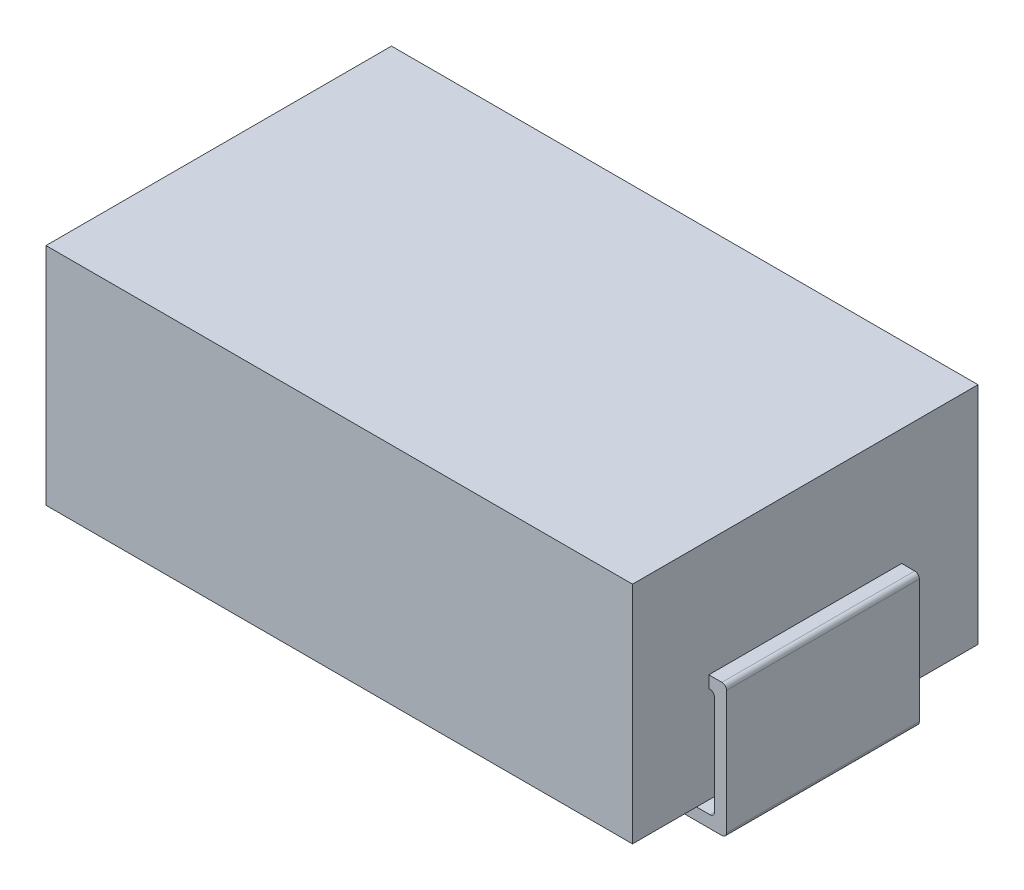
ISO-10303-21;
HEADER;
FILE_DESCRIPTION(('STEP AP214'),'2;1');
FILE_NAME('part.step','',(''),(''),'','','');
FILE_SCHEMA(('AUTOMOTIVE_DESIGN { 1 0 10303 214 1 1 1 1 }'));
ENDSEC;
DATA;
#1=APPLICATION_CONTEXT('core data for automotive mechanical design processes');
#2=APPLICATION_PROTOCOL_DEFINITION('international standard','automotive_design',2000,#1);
#3=PRODUCT_CONTEXT('',#1,'mechanical');
#4=PRODUCT('Part','Part','',(#3));
#5=PRODUCT_RELATED_PRODUCT_CATEGORY('part','',(#4));
#6=PRODUCT_DEFINITION_FORMATION('','',#4);
#7=PRODUCT_DEFINITION_CONTEXT('part definition',#1,'design');
#8=PRODUCT_DEFINITION('design','',#6,#7);
#9=PRODUCT_DEFINITION_SHAPE('','',#8);
#10=(LENGTH_UNIT() NAMED_UNIT(*) SI_UNIT(.MILLI.,.METRE.));
#11=(NAMED_UNIT(*) PLANE_ANGLE_UNIT() SI_UNIT($,.RADIAN.));
#12=(NAMED_UNIT(*) SI_UNIT($,.STERADIAN.) SOLID_ANGLE_UNIT());
#13=UNCERTAINTY_MEASURE_WITH_UNIT(LENGTH_MEASURE(1.E-05),#10,'distance_accuracy_value','');
#14=(GEOMETRIC_REPRESENTATION_CONTEXT(3) GLOBAL_UNCERTAINTY_ASSIGNED_CONTEXT((#13)) GLOBAL_UNIT_ASSIGNED_CONTEXT((#10,
#11,#12)) REPRESENTATION_CONTEXT('',''));
#15=CARTESIAN_POINT('',(0.,0.,0.));
#16=DIRECTION('',(0.,0.,1.));
#17=DIRECTION('',(1.,0.,0.));
#18=AXIS2_PLACEMENT_3D('',#15,#16,#17);
#19=CARTESIAN_POINT('',(-1.327542889156,-0.210787173708,1.2));
#20=DIRECTION('',(-1.,0.,0.));
#21=DIRECTION('',(0.,0.,1.));
#22=AXIS2_PLACEMENT_3D('',#19,#20,#21);
#23=PLANE('',#22);
#24=DIRECTION('',(0.,0.,-1.));
#25=VECTOR('',#24,1.);
#26=CARTESIAN_POINT('',(-1.32754288915623,-0.210787173708,1.2));
#27=LINE('',#26,#25);
#28=CARTESIAN_POINT('',(-1.32754288915612,-0.210787173708,1.2));
#29=VERTEX_POINT('',#28);
#30=CARTESIAN_POINT('',(-1.32754288915612,-0.210787173708,-1.2));
#31=VERTEX_POINT('',#30);
#32=EDGE_CURVE('E234',#29,#31,#27,.T.);
#33=ORIENTED_EDGE('',*,*,#32,.F.);
#34=DIRECTION('',(0.,1.,0.));
#35=VECTOR('',#34,1.);
#36=CARTESIAN_POINT('',(-1.327542889156,1.290695496503,1.2));
#37=LINE('',#36,#35);
#38=CARTESIAN_POINT('',(-1.32754288915612,-0.245870504814,1.2));
#39=VERTEX_POINT('',#38);
#40=EDGE_CURVE('E249',#39,#29,#37,.T.);
#41=ORIENTED_EDGE('',*,*,#40,.F.);
#42=DIRECTION('',(0.,0.,-1.));
#43=VECTOR('',#42,1.);
#44=CARTESIAN_POINT('',(-1.32754288915623,-0.245870504814,1.2));
#45=LINE('',#44,#43);
#46=CARTESIAN_POINT('',(-1.32754288915612,-0.245870504814,-1.2));
#47=VERTEX_POINT('',#46);
#48=EDGE_CURVE('E362',#47,#39,#45,.F.);
#49=ORIENTED_EDGE('',*,*,#48,.F.);
#50=DIRECTION('',(0.,1.,0.));
#51=VECTOR('',#50,1.);
#52=CARTESIAN_POINT('',(-1.327542889156,-0.210787173708,-1.2));
#53=LINE('',#52,#51);
#54=EDGE_CURVE('E325',#31,#47,#53,.F.);
#55=ORIENTED_EDGE('',*,*,#54,.F.);
#56=EDGE_LOOP('',(#33,#41,#49,#55));
#57=FACE_BOUND('',#56,.T.);
#58=ADVANCED_FACE('F17',(#57),#23,.F.);
#59=CARTESIAN_POINT('',(1.327542889156,-0.210787173708,1.2));
#60=DIRECTION('',(-1.,0.,0.));
#61=DIRECTION('',(0.,0.,1.));
#62=AXIS2_PLACEMENT_3D('',#59,#60,#61);
#63=PLANE('',#62);
#64=DIRECTION('',(0.,1.,0.));
#65=VECTOR('',#64,1.);
#66=CARTESIAN_POINT('',(1.327542889156,-0.210787173708,1.2));
#67=LINE('',#66,#65);
#68=CARTESIAN_POINT('',(1.32754288915612,-0.245870504814,1.2));
#69=VERTEX_POINT('',#68);
#70=CARTESIAN_POINT('',(1.32754288915612,-0.210787173708,1.2));
#71=VERTEX_POINT('',#70);
#72=EDGE_CURVE('E323',#69,#71,#67,.T.);
#73=ORIENTED_EDGE('',*,*,#72,.T.);
#74=DIRECTION('',(0.,0.,-1.));
#75=VECTOR('',#74,1.);
#76=CARTESIAN_POINT('',(1.32754288915623,-0.210787173708,1.2));
#77=LINE('',#76,#75);
#78=CARTESIAN_POINT('',(1.32754288915612,-0.210787173708,-1.2));
#79=VERTEX_POINT('',#78);
#80=EDGE_CURVE('E281',#79,#71,#77,.F.);
#81=ORIENTED_EDGE('',*,*,#80,.F.);
#82=DIRECTION('',(0.,1.,0.));
#83=VECTOR('',#82,1.);
#84=CARTESIAN_POINT('',(1.327542889156,1.290695496503,-1.2));
#85=LINE('',#84,#83);
#86=CARTESIAN_POINT('',(1.32754288915612,-0.245870504814,-1.2));
#87=VERTEX_POINT('',#86);
#88=EDGE_CURVE('E396',#79,#87,#85,.F.);
#89=ORIENTED_EDGE('',*,*,#88,.T.);
#90=DIRECTION('',(0.,0.,-1.));
#91=VECTOR('',#90,1.);
#92=CARTESIAN_POINT('',(1.32754288915623,-0.245870504814,1.2));
#93=LINE('',#92,#91);
#94=EDGE_CURVE('E278',#69,#87,#93,.T.);
#95=ORIENTED_EDGE('',*,*,#94,.F.);
#96=EDGE_LOOP('',(#73,#81,#89,#95));
#97=FACE_BOUND('',#96,.T.);
#98=ADVANCED_FACE('F587',(#97),#63,.T.);
#99=CARTESIAN_POINT('',(-1.385001223603,-0.210787173708,1.2));
#100=DIRECTION('',(0.,0.,-1.));
#101=DIRECTION('',(-1.,0.,0.));
#102=AXIS2_PLACEMENT_3D('',#99,#100,#101);
#103=CYLINDRICAL_SURFACE('',#102,0.05745833444677);
#104=CARTESIAN_POINT('',(-1.385001223603,-0.210787173708,1.2));
#105=DIRECTION('',(0.,0.,-1.));
#106=DIRECTION('',(-1.,0.,0.));
#107=AXIS2_PLACEMENT_3D('',#104,#105,#106);
#108=CIRCLE('',#107,0.05745833444677);
#109=CARTESIAN_POINT('',(-1.385001223603,-0.153328839261,1.2));
#110=VERTEX_POINT('',#109);
#111=EDGE_CURVE('E250',#29,#110,#108,.F.);
#112=ORIENTED_EDGE('',*,*,#111,.F.);
#113=ORIENTED_EDGE('',*,*,#32,.T.);
#114=CARTESIAN_POINT('',(-1.385001223603,-0.210787173708,-1.2));
#115=DIRECTION('',(0.,0.,-1.));
#116=DIRECTION('',(-1.,0.,0.));
#117=AXIS2_PLACEMENT_3D('',#114,#115,#116);
#118=CIRCLE('',#117,0.05745833444677);
#119=CARTESIAN_POINT('',(-1.385001223603,-0.153328839261,-1.2));
#120=VERTEX_POINT('',#119);
#121=EDGE_CURVE('E413',#31,#120,#118,.F.);
#122=ORIENTED_EDGE('',*,*,#121,.T.);
#123=DIRECTION('',(0.,0.,-1.));
#124=VECTOR('',#123,1.);
#125=CARTESIAN_POINT('',(-1.385001223603,-0.153328839261,1.2));
#126=LINE('',#125,#124);
#127=EDGE_CURVE('E269',#120,#110,#126,.F.);
#128=ORIENTED_EDGE('',*,*,#127,.T.);
#129=EDGE_LOOP('',(#112,#113,#122,#128));
#130=FACE_BOUND('',#129,.T.);
#131=ADVANCED_FACE('F870',(#130),#103,.T.);
#132=CARTESIAN_POINT('',(-3.812785749813,1.290695496503,1.2));
#133=DIRECTION('',(0.,0.,1.));
#134=DIRECTION('',(1.,0.,0.));
#135=AXIS2_PLACEMENT_3D('',#132,#133,#134);
#136=PLANE('',#135);
#137=DIRECTION('',(1.,0.,0.));
#138=VECTOR('',#137,1.);
#139=CARTESIAN_POINT('',(-3.812785749813,1.348153830949,1.2));
#140=LINE('',#139,#138);
#141=CARTESIAN_POINT('',(-3.65,1.348153830949,1.2));
#142=VERTEX_POINT('',#141);
#143=CARTESIAN_POINT('',(-3.812785749813,1.348153830949,1.2));
#144=VERTEX_POINT('',#143);
#145=EDGE_CURVE('E368',#142,#144,#140,.F.);
#146=ORIENTED_EDGE('',*,*,#145,.T.);
#147=CARTESIAN_POINT('',(-3.812785749813,1.290695496503,1.2));
#148=DIRECTION('',(0.,0.,-1.));
#149=DIRECTION('',(-1.,0.,0.));
#150=AXIS2_PLACEMENT_3D('',#147,#148,#149);
#151=CIRCLE('',#150,0.05745833444677);
#152=CARTESIAN_POINT('',(-3.87024408425939,1.290695496503,1.2));
#153=VERTEX_POINT('',#152);
#154=EDGE_CURVE('E230',#144,#153,#151,.F.);
#155=ORIENTED_EDGE('',*,*,#154,.T.);
#156=DIRECTION('',(0.,1.,0.));
#157=VECTOR('',#156,1.);
#158=CARTESIAN_POINT('',(-3.870244084259,1.290695496503,1.2));
#159=LINE('',#158,#157);
#160=CARTESIAN_POINT('',(-3.870244084259,-0.245870504814,1.2));
#161=VERTEX_POINT('',#160);
#162=EDGE_CURVE('E223',#153,#161,#159,.F.);
#163=ORIENTED_EDGE('',*,*,#162,.T.);
#164=CARTESIAN_POINT('',(-3.812785749813,-0.245870504814,1.2));
#165=DIRECTION('',(0.,0.,-1.));
#166=DIRECTION('',(-1.,0.,0.));
#167=AXIS2_PLACEMENT_3D('',#164,#165,#166);
#168=CIRCLE('',#167,0.05745833444677);
#169=CARTESIAN_POINT('',(-3.812785749813,-0.303328839260885,1.2));
#170=VERTEX_POINT('',#169);
#171=EDGE_CURVE('E20',#161,#170,#168,.F.);
#172=ORIENTED_EDGE('',*,*,#171,.T.);
#173=DIRECTION('',(1.,0.,0.));
#174=VECTOR('',#173,1.);
#175=CARTESIAN_POINT('',(-3.812785749813,-0.303328839261,1.2));
#176=LINE('',#175,#174);
#177=CARTESIAN_POINT('',(-1.385001223603,-0.303328839261,1.2));
#178=VERTEX_POINT('',#177);
#179=EDGE_CURVE('E267',#170,#178,#176,.T.);
#180=ORIENTED_EDGE('',*,*,#179,.T.);
#181=CARTESIAN_POINT('',(-1.385001223603,-0.245870504814,1.2));
#182=DIRECTION('',(0.,0.,-1.));
#183=DIRECTION('',(-1.,0.,0.));
#184=AXIS2_PLACEMENT_3D('',#181,#182,#183);
#185=CIRCLE('',#184,0.05745833444677);
#186=EDGE_CURVE('E364',#39,#178,#185,.T.);
#187=ORIENTED_EDGE('',*,*,#186,.F.);
#188=ORIENTED_EDGE('',*,*,#40,.T.);
#189=ORIENTED_EDGE('',*,*,#111,.T.);
#190=DIRECTION('',(1.,0.,0.));
#191=VECTOR('',#190,1.);
#192=CARTESIAN_POINT('',(-3.662785749813,-0.153328839261,1.2));
#193=LINE('',#192,#191);
#194=CARTESIAN_POINT('',(-3.662785749813,-0.153328839261065,1.2));
#195=VERTEX_POINT('',#194);
#196=EDGE_CURVE('E268',#110,#195,#193,.F.);
#197=ORIENTED_EDGE('',*,*,#196,.T.);
#198=CARTESIAN_POINT('',(-3.662785749813,-0.09587050481436,1.2));
#199=DIRECTION('',(0.,0.,-1.));
#200=DIRECTION('',(-1.,0.,0.));
#201=AXIS2_PLACEMENT_3D('',#198,#199,#200);
#202=CIRCLE('',#201,0.05745833444677);
#203=CARTESIAN_POINT('',(-3.720244084259,-0.09587050481436,1.2));
#204=VERTEX_POINT('',#203);
#205=EDGE_CURVE('E255',#195,#204,#202,.T.);
#206=ORIENTED_EDGE('',*,*,#205,.T.);
#207=DIRECTION('',(0.,1.,0.));
#208=VECTOR('',#207,1.);
#209=CARTESIAN_POINT('',(-3.720244084259,1.290695496503,1.2));
#210=LINE('',#209,#208);
#211=CARTESIAN_POINT('',(-3.72024408425939,1.142356626712,1.2));
#212=VERTEX_POINT('',#211);
#213=EDGE_CURVE('E257',#204,#212,#210,.T.);
#214=ORIENTED_EDGE('',*,*,#213,.T.);
#215=CARTESIAN_POINT('',(-3.662785749813,1.142356626712,1.2));
#216=DIRECTION('',(0.,0.,-1.));
#217=DIRECTION('',(-1.,0.,0.));
#218=AXIS2_PLACEMENT_3D('',#215,#216,#217);
#219=CIRCLE('',#218,0.05745833444677);
#220=CARTESIAN_POINT('',(-3.662785749813,1.199814961159,1.2));
#221=VERTEX_POINT('',#220);
#222=EDGE_CURVE('E423',#212,#221,#219,.T.);
#223=ORIENTED_EDGE('',*,*,#222,.T.);
#224=DIRECTION('',(1.,0.,0.));
#225=VECTOR('',#224,1.);
#226=CARTESIAN_POINT('',(-3.812785749813,1.199814961159,1.2));
#227=LINE('',#226,#225);
#228=CARTESIAN_POINT('',(-3.65,1.199814961159,1.2));
#229=VERTEX_POINT('',#228);
#230=EDGE_CURVE('E369',#221,#229,#227,.T.);
#231=ORIENTED_EDGE('',*,*,#230,.T.);
#232=DIRECTION('',(0.,1.,0.));
#233=VECTOR('',#232,1.);
#234=CARTESIAN_POINT('',(-3.65,1.290695496503,1.2));
#235=LINE('',#234,#233);
#236=EDGE_CURVE('E366',#229,#142,#235,.T.);
#237=ORIENTED_EDGE('',*,*,#236,.T.);
#238=EDGE_LOOP('',(#146,#155,#163,#172,#180,#187,#188,#189,#197,#206,#214,#223,#231,#237));
#239=FACE_BOUND('',#238,.T.);
#240=ADVANCED_FACE('F225',(#239),#136,.T.);
#241=CARTESIAN_POINT('',(-1.385001223603,-0.245870504814,1.2));
#242=DIRECTION('',(0.,0.,-1.));
#243=DIRECTION('',(-1.,0.,0.));
#244=AXIS2_PLACEMENT_3D('',#241,#242,#243);
#245=CYLINDRICAL_SURFACE('',#244,0.05745833444677);
#246=ORIENTED_EDGE('',*,*,#186,.T.);
#247=DIRECTION('',(0.,0.,1.));
#248=VECTOR('',#247,1.);
#249=CARTESIAN_POINT('',(-1.385001223603,-0.303328839261,1.2));
#250=LINE('',#249,#248);
#251=CARTESIAN_POINT('',(-1.385001223603,-0.303328839261,-1.2));
#252=VERTEX_POINT('',#251);
#253=EDGE_CURVE('E448',#178,#252,#250,.F.);
#254=ORIENTED_EDGE('',*,*,#253,.T.);
#255=CARTESIAN_POINT('',(-1.385001223603,-0.245870504814,-1.2));
#256=DIRECTION('',(0.,0.,-1.));
#257=DIRECTION('',(-1.,0.,0.));
#258=AXIS2_PLACEMENT_3D('',#255,#256,#257);
#259=CIRCLE('',#258,0.05745833444677);
#260=EDGE_CURVE('E416',#252,#47,#259,.F.);
#261=ORIENTED_EDGE('',*,*,#260,.T.);
#262=ORIENTED_EDGE('',*,*,#48,.T.);
#263=EDGE_LOOP('',(#246,#254,#261,#262));
#264=FACE_BOUND('',#263,.T.);
#265=ADVANCED_FACE('F853',(#264),#245,.T.);
#266=CARTESIAN_POINT('',(-3.812785749813,1.290695496503,-1.2));
#267=DIRECTION('',(0.,0.,1.));
#268=DIRECTION('',(1.,0.,0.));
#269=AXIS2_PLACEMENT_3D('',#266,#267,#268);
#270=PLANE('',#269);
#271=CARTESIAN_POINT('',(-3.812785749813,1.290695496503,-1.2));
#272=DIRECTION('',(0.,0.,-1.));
#273=DIRECTION('',(-1.,0.,0.));
#274=AXIS2_PLACEMENT_3D('',#271,#272,#273);
#275=CIRCLE('',#274,0.05745833444677);
#276=CARTESIAN_POINT('',(-3.812785749813,1.348153830949,-1.2));
#277=VERTEX_POINT('',#276);
#278=CARTESIAN_POINT('',(-3.87024408425939,1.290695496503,-1.2));
#279=VERTEX_POINT('',#278);
#280=EDGE_CURVE('E403',#277,#279,#275,.F.);
#281=ORIENTED_EDGE('',*,*,#280,.F.);
#282=DIRECTION('',(1.,0.,0.));
#283=VECTOR('',#282,1.);
#284=CARTESIAN_POINT('',(-3.812785749813,1.348153830949,-1.2));
#285=LINE('',#284,#283);
#286=CARTESIAN_POINT('',(-3.65,1.348153830949,-1.2));
#287=VERTEX_POINT('',#286);
#288=EDGE_CURVE('E345',#287,#277,#285,.F.);
#289=ORIENTED_EDGE('',*,*,#288,.F.);
#290=DIRECTION('',(0.,1.,0.));
#291=VECTOR('',#290,1.);
#292=CARTESIAN_POINT('',(-3.65,1.290695496503,-1.2));
#293=LINE('',#292,#291);
#294=CARTESIAN_POINT('',(-3.65,1.199814961159,-1.2));
#295=VERTEX_POINT('',#294);
#296=EDGE_CURVE('E342',#295,#287,#293,.T.);
#297=ORIENTED_EDGE('',*,*,#296,.F.);
#298=DIRECTION('',(1.,0.,0.));
#299=VECTOR('',#298,1.);
#300=CARTESIAN_POINT('',(-3.812785749813,1.199814961159,-1.2));
#301=LINE('',#300,#299);
#302=CARTESIAN_POINT('',(-3.662785749813,1.199814961159,-1.2));
#303=VERTEX_POINT('',#302);
#304=EDGE_CURVE('E346',#303,#295,#301,.T.);
#305=ORIENTED_EDGE('',*,*,#304,.F.);
#306=CARTESIAN_POINT('',(-3.662785749813,1.142356626712,-1.2));
#307=DIRECTION('',(0.,0.,-1.));
#308=DIRECTION('',(-1.,0.,0.));
#309=AXIS2_PLACEMENT_3D('',#306,#307,#308);
#310=CIRCLE('',#309,0.05745833444677);
#311=CARTESIAN_POINT('',(-3.72024408425939,1.142356626712,-1.2));
#312=VERTEX_POINT('',#311);
#313=EDGE_CURVE('E406',#312,#303,#310,.T.);
#314=ORIENTED_EDGE('',*,*,#313,.F.);
#315=DIRECTION('',(0.,1.,0.));
#316=VECTOR('',#315,1.);
#317=CARTESIAN_POINT('',(-3.720244084259,1.290695496503,-1.2));
#318=LINE('',#317,#316);
#319=CARTESIAN_POINT('',(-3.720244084259,-0.09587050481436,-1.2));
#320=VERTEX_POINT('',#319);
#321=EDGE_CURVE('E409',#320,#312,#318,.T.);
#322=ORIENTED_EDGE('',*,*,#321,.F.);
#323=CARTESIAN_POINT('',(-3.662785749813,-0.09587050481436,-1.2));
#324=DIRECTION('',(0.,0.,-1.));
#325=DIRECTION('',(-1.,0.,0.));
#326=AXIS2_PLACEMENT_3D('',#323,#324,#325);
#327=CIRCLE('',#326,0.05745833444677);
#328=CARTESIAN_POINT('',(-3.662785749813,-0.153328839261065,-1.2));
#329=VERTEX_POINT('',#328);
#330=EDGE_CURVE('E410',#329,#320,#327,.T.);
#331=ORIENTED_EDGE('',*,*,#330,.F.);
#332=DIRECTION('',(1.,0.,0.));
#333=VECTOR('',#332,1.);
#334=CARTESIAN_POINT('',(-3.662785749813,-0.153328839261,-1.2));
#335=LINE('',#334,#333);
#336=EDGE_CURVE('E264',#329,#120,#335,.T.);
#337=ORIENTED_EDGE('',*,*,#336,.T.);
#338=ORIENTED_EDGE('',*,*,#121,.F.);
#339=ORIENTED_EDGE('',*,*,#54,.T.);
#340=ORIENTED_EDGE('',*,*,#260,.F.);
#341=DIRECTION('',(1.,0.,0.));
#342=VECTOR('',#341,1.);
#343=CARTESIAN_POINT('',(-3.812785749813,-0.303328839261,-1.2));
#344=LINE('',#343,#342);
#345=CARTESIAN_POINT('',(-3.812785749813,-0.303328839260885,-1.2));
#346=VERTEX_POINT('',#345);
#347=EDGE_CURVE('E451',#252,#346,#344,.F.);
#348=ORIENTED_EDGE('',*,*,#347,.T.);
#349=CARTESIAN_POINT('',(-3.812785749813,-0.245870504814,-1.2));
#350=DIRECTION('',(0.,0.,-1.));
#351=DIRECTION('',(-1.,0.,0.));
#352=AXIS2_PLACEMENT_3D('',#349,#350,#351);
#353=CIRCLE('',#352,0.05745833444677);
#354=CARTESIAN_POINT('',(-3.870244084259,-0.245870504814,-1.2));
#355=VERTEX_POINT('',#354);
#356=EDGE_CURVE('E419',#355,#346,#353,.F.);
#357=ORIENTED_EDGE('',*,*,#356,.F.);
#358=DIRECTION('',(0.,1.,0.));
#359=VECTOR('',#358,1.);
#360=CARTESIAN_POINT('',(-3.870244084259,1.290695496503,-1.2));
#361=LINE('',#360,#359);
#362=EDGE_CURVE('E240',#279,#355,#361,.F.);
#363=ORIENTED_EDGE('',*,*,#362,.F.);
#364=EDGE_LOOP('',(#281,#289,#297,#305,#314,#322,#331,#337,#338,#339,#340,#348,#357,#363));
#365=FACE_BOUND('',#364,.T.);
#366=ADVANCED_FACE('F845',(#365),#270,.F.);
#367=CARTESIAN_POINT('',(1.385001223603,-0.245870504814,1.2));
#368=DIRECTION('',(0.,0.,-1.));
#369=DIRECTION('',(-1.,0.,0.));
#370=AXIS2_PLACEMENT_3D('',#367,#368,#369);
#371=CYLINDRICAL_SURFACE('',#370,0.05745833444677);
#372=CARTESIAN_POINT('',(1.385001223603,-0.245870504814,1.2));
#373=DIRECTION('',(0.,0.,-1.));
#374=DIRECTION('',(-1.,0.,0.));
#375=AXIS2_PLACEMENT_3D('',#372,#373,#374);
#376=CIRCLE('',#375,0.05745833444677);
#377=CARTESIAN_POINT('',(1.385001223603,-0.303328839261,1.2));
#378=VERTEX_POINT('',#377);
#379=EDGE_CURVE('E373',#69,#378,#376,.F.);
#380=ORIENTED_EDGE('',*,*,#379,.F.);
#381=ORIENTED_EDGE('',*,*,#94,.T.);
#382=CARTESIAN_POINT('',(1.385001223603,-0.245870504814,-1.2));
#383=DIRECTION('',(0.,0.,-1.));
#384=DIRECTION('',(-1.,0.,0.));
#385=AXIS2_PLACEMENT_3D('',#382,#383,#384);
#386=CIRCLE('',#385,0.05745833444677);
#387=CARTESIAN_POINT('',(1.385001223603,-0.303328839261,-1.2));
#388=VERTEX_POINT('',#387);
#389=EDGE_CURVE('E394',#87,#388,#386,.F.);
#390=ORIENTED_EDGE('',*,*,#389,.T.);
#391=DIRECTION('',(0.,0.,-1.));
#392=VECTOR('',#391,1.);
#393=CARTESIAN_POINT('',(1.385001223603,-0.303328839261,1.2));
#394=LINE('',#393,#392);
#395=EDGE_CURVE('E469',#378,#388,#394,.T.);
#396=ORIENTED_EDGE('',*,*,#395,.F.);
#397=EDGE_LOOP('',(#380,#381,#390,#396));
#398=FACE_BOUND('',#397,.T.);
#399=ADVANCED_FACE('F592',(#398),#371,.T.);
#400=CARTESIAN_POINT('',(3.812785749813,1.290695496503,-1.2));
#401=DIRECTION('',(0.,0.,1.));
#402=DIRECTION('',(1.,0.,0.));
#403=AXIS2_PLACEMENT_3D('',#400,#401,#402);
#404=PLANE('',#403);
#405=DIRECTION('',(0.,1.,0.));
#406=VECTOR('',#405,1.);
#407=CARTESIAN_POINT('',(3.870244084259,1.290695496503,-1.2));
#408=LINE('',#407,#406);
#409=CARTESIAN_POINT('',(3.870244084259,-0.245870504814,-1.2));
#410=VERTEX_POINT('',#409);
#411=CARTESIAN_POINT('',(3.87024408425939,1.290695496503,-1.2));
#412=VERTEX_POINT('',#411);
#413=EDGE_CURVE('E390',#410,#412,#408,.T.);
#414=ORIENTED_EDGE('',*,*,#413,.F.);
#415=CARTESIAN_POINT('',(3.812785749813,-0.245870504814,-1.2));
#416=DIRECTION('',(0.,0.,-1.));
#417=DIRECTION('',(-1.,0.,0.));
#418=AXIS2_PLACEMENT_3D('',#415,#416,#417);
#419=CIRCLE('',#418,0.05745833444677);
#420=CARTESIAN_POINT('',(3.812785749813,-0.303328839260885,-1.2));
#421=VERTEX_POINT('',#420);
#422=EDGE_CURVE('E391',#421,#410,#419,.F.);
#423=ORIENTED_EDGE('',*,*,#422,.F.);
#424=DIRECTION('',(1.,0.,0.));
#425=VECTOR('',#424,1.);
#426=CARTESIAN_POINT('',(3.812785749813,-0.303328839261,-1.2));
#427=LINE('',#426,#425);
#428=EDGE_CURVE('E454',#388,#421,#427,.T.);
#429=ORIENTED_EDGE('',*,*,#428,.F.);
#430=ORIENTED_EDGE('',*,*,#389,.F.);
#431=ORIENTED_EDGE('',*,*,#88,.F.);
#432=CARTESIAN_POINT('',(1.385001223603,-0.210787173708,-1.2));
#433=DIRECTION('',(0.,0.,-1.));
#434=DIRECTION('',(-1.,0.,0.));
#435=AXIS2_PLACEMENT_3D('',#432,#433,#434);
#436=CIRCLE('',#435,0.05745833444677);
#437=CARTESIAN_POINT('',(1.385001223603,-0.153328839261,-1.2));
#438=VERTEX_POINT('',#437);
#439=EDGE_CURVE('E285',#438,#79,#436,.F.);
#440=ORIENTED_EDGE('',*,*,#439,.F.);
#441=DIRECTION('',(1.,0.,0.));
#442=VECTOR('',#441,1.);
#443=CARTESIAN_POINT('',(3.662785749813,-0.153328839261,-1.2));
#444=LINE('',#443,#442);
#445=CARTESIAN_POINT('',(3.662785749813,-0.153328839261065,-1.2));
#446=VERTEX_POINT('',#445);
#447=EDGE_CURVE('E472',#446,#438,#444,.F.);
#448=ORIENTED_EDGE('',*,*,#447,.F.);
#449=CARTESIAN_POINT('',(3.662785749813,-0.09587050481436,-1.2));
#450=DIRECTION('',(0.,0.,-1.));
#451=DIRECTION('',(-1.,0.,0.));
#452=AXIS2_PLACEMENT_3D('',#449,#450,#451);
#453=CIRCLE('',#452,0.05745833444677);
#454=CARTESIAN_POINT('',(3.720244084259,-0.09587050481436,-1.2));
#455=VERTEX_POINT('',#454);
#456=EDGE_CURVE('E397',#455,#446,#453,.T.);
#457=ORIENTED_EDGE('',*,*,#456,.F.);
#458=DIRECTION('',(0.,1.,0.));
#459=VECTOR('',#458,1.);
#460=CARTESIAN_POINT('',(3.720244084259,1.290695496503,-1.2));
#461=LINE('',#460,#459);
#462=CARTESIAN_POINT('',(3.72024408425939,1.142356626712,-1.2));
#463=VERTEX_POINT('',#462);
#464=EDGE_CURVE('E399',#463,#455,#461,.F.);
#465=ORIENTED_EDGE('',*,*,#464,.F.);
#466=CARTESIAN_POINT('',(3.662785749813,1.142356626712,-1.2));
#467=DIRECTION('',(0.,0.,-1.));
#468=DIRECTION('',(-1.,0.,0.));
#469=AXIS2_PLACEMENT_3D('',#466,#467,#468);
#470=CIRCLE('',#469,0.05745833444677);
#471=CARTESIAN_POINT('',(3.662785749813,1.199814961159,-1.2));
#472=VERTEX_POINT('',#471);
#473=EDGE_CURVE('E400',#472,#463,#470,.T.);
#474=ORIENTED_EDGE('',*,*,#473,.F.);
#475=DIRECTION('',(1.,0.,0.));
#476=VECTOR('',#475,1.);
#477=CARTESIAN_POINT('',(3.812785749813,1.199814961159,-1.2));
#478=LINE('',#477,#476);
#479=CARTESIAN_POINT('',(3.65,1.199814961159,-1.2));
#480=VERTEX_POINT('',#479);
#481=EDGE_CURVE('E329',#480,#472,#478,.T.);
#482=ORIENTED_EDGE('',*,*,#481,.F.);
#483=DIRECTION('',(0.,1.,0.));
#484=VECTOR('',#483,1.);
#485=CARTESIAN_POINT('',(3.65,1.290695496503,-1.2));
#486=LINE('',#485,#484);
#487=CARTESIAN_POINT('',(3.65,1.348153830949,-1.2));
#488=VERTEX_POINT('',#487);
#489=EDGE_CURVE('E326',#488,#480,#486,.F.);
#490=ORIENTED_EDGE('',*,*,#489,.F.);
#491=DIRECTION('',(1.,0.,0.));
#492=VECTOR('',#491,1.);
#493=CARTESIAN_POINT('',(3.812785749813,1.348153830949,-1.2));
#494=LINE('',#493,#492);
#495=CARTESIAN_POINT('',(3.812785749813,1.348153830949,-1.2));
#496=VERTEX_POINT('',#495);
#497=EDGE_CURVE('E280',#496,#488,#494,.F.);
#498=ORIENTED_EDGE('',*,*,#497,.F.);
#499=CARTESIAN_POINT('',(3.812785749813,1.290695496503,-1.2));
#500=DIRECTION('',(0.,0.,-1.));
#501=DIRECTION('',(-1.,0.,0.));
#502=AXIS2_PLACEMENT_3D('',#499,#500,#501);
#503=CIRCLE('',#502,0.05745833444677);
#504=EDGE_CURVE('E387',#412,#496,#503,.F.);
#505=ORIENTED_EDGE('',*,*,#504,.F.);
#506=EDGE_LOOP('',(#414,#423,#429,#430,#431,#440,#448,#457,#465,#474,#482,#490,#498,#505));
#507=FACE_BOUND('',#506,.T.);
#508=ADVANCED_FACE('F559',(#507),#404,.F.);
#509=CARTESIAN_POINT('',(1.385001223603,-0.210787173708,1.2));
#510=DIRECTION('',(0.,0.,-1.));
#511=DIRECTION('',(-1.,0.,0.));
#512=AXIS2_PLACEMENT_3D('',#509,#510,#511);
#513=CYLINDRICAL_SURFACE('',#512,0.05745833444677);
#514=CARTESIAN_POINT('',(1.385001223603,-0.210787173708,1.2));
#515=DIRECTION('',(0.,0.,-1.));
#516=DIRECTION('',(-1.,0.,0.));
#517=AXIS2_PLACEMENT_3D('',#514,#515,#516);
#518=CIRCLE('',#517,0.05745833444677);
#519=CARTESIAN_POINT('',(1.385001223603,-0.153328839261,1.2));
#520=VERTEX_POINT('',#519);
#521=EDGE_CURVE('E375',#520,#71,#518,.F.);
#522=ORIENTED_EDGE('',*,*,#521,.F.);
#523=DIRECTION('',(0.,0.,1.));
#524=VECTOR('',#523,1.);
#525=CARTESIAN_POINT('',(1.385001223603,-0.153328839261,1.2));
#526=LINE('',#525,#524);
#527=EDGE_CURVE('E492',#438,#520,#526,.T.);
#528=ORIENTED_EDGE('',*,*,#527,.F.);
#529=ORIENTED_EDGE('',*,*,#439,.T.);
#530=ORIENTED_EDGE('',*,*,#80,.T.);
#531=EDGE_LOOP('',(#522,#528,#529,#530));
#532=FACE_BOUND('',#531,.T.);
#533=ADVANCED_FACE('F584',(#532),#513,.T.);
#534=CARTESIAN_POINT('',(3.812785749813,1.290695496503,1.2));
#535=DIRECTION('',(0.,0.,1.));
#536=DIRECTION('',(1.,0.,0.));
#537=AXIS2_PLACEMENT_3D('',#534,#535,#536);
#538=PLANE('',#537);
#539=DIRECTION('',(1.,0.,0.));
#540=VECTOR('',#539,1.);
#541=CARTESIAN_POINT('',(3.812785749813,-0.303328839261,1.2));
#542=LINE('',#541,#540);
#543=CARTESIAN_POINT('',(3.812785749813,-0.303328839260885,1.2));
#544=VERTEX_POINT('',#543);
#545=EDGE_CURVE('E468',#544,#378,#542,.F.);
#546=ORIENTED_EDGE('',*,*,#545,.F.);
#547=CARTESIAN_POINT('',(3.812785749813,-0.245870504814,1.2));
#548=DIRECTION('',(0.,0.,-1.));
#549=DIRECTION('',(-1.,0.,0.));
#550=AXIS2_PLACEMENT_3D('',#547,#548,#549);
#551=CIRCLE('',#550,0.05745833444677);
#552=CARTESIAN_POINT('',(3.870244084259,-0.245870504814,1.2));
#553=VERTEX_POINT('',#552);
#554=EDGE_CURVE('E272',#544,#553,#551,.F.);
#555=ORIENTED_EDGE('',*,*,#554,.T.);
#556=DIRECTION('',(0.,1.,0.));
#557=VECTOR('',#556,1.);
#558=CARTESIAN_POINT('',(3.870244084259,1.290695496503,1.2));
#559=LINE('',#558,#557);
#560=CARTESIAN_POINT('',(3.87024408425939,1.290695496503,1.2));
#561=VERTEX_POINT('',#560);
#562=EDGE_CURVE('E284',#553,#561,#559,.T.);
#563=ORIENTED_EDGE('',*,*,#562,.T.);
#564=CARTESIAN_POINT('',(3.812785749813,1.290695496503,1.2));
#565=DIRECTION('',(0.,0.,-1.));
#566=DIRECTION('',(-1.,0.,0.));
#567=AXIS2_PLACEMENT_3D('',#564,#565,#566);
#568=CIRCLE('',#567,0.05745833444677);
#569=CARTESIAN_POINT('',(3.812785749813,1.348153830949,1.2));
#570=VERTEX_POINT('',#569);
#571=EDGE_CURVE('E383',#561,#570,#568,.F.);
#572=ORIENTED_EDGE('',*,*,#571,.T.);
#573=DIRECTION('',(1.,0.,0.));
#574=VECTOR('',#573,1.);
#575=CARTESIAN_POINT('',(3.812785749813,1.348153830949,1.2));
#576=LINE('',#575,#574);
#577=CARTESIAN_POINT('',(3.65,1.348153830949,1.2));
#578=VERTEX_POINT('',#577);
#579=EDGE_CURVE('E309',#570,#578,#576,.F.);
#580=ORIENTED_EDGE('',*,*,#579,.T.);
#581=DIRECTION('',(0.,1.,0.));
#582=VECTOR('',#581,1.);
#583=CARTESIAN_POINT('',(3.65,1.290695496503,1.2));
#584=LINE('',#583,#582);
#585=CARTESIAN_POINT('',(3.65,1.199814961159,1.2));
#586=VERTEX_POINT('',#585);
#587=EDGE_CURVE('E306',#578,#586,#584,.F.);
#588=ORIENTED_EDGE('',*,*,#587,.T.);
#589=DIRECTION('',(1.,0.,0.));
#590=VECTOR('',#589,1.);
#591=CARTESIAN_POINT('',(3.812785749813,1.199814961159,1.2));
#592=LINE('',#591,#590);
#593=CARTESIAN_POINT('',(3.662785749813,1.199814961159,1.2));
#594=VERTEX_POINT('',#593);
#595=EDGE_CURVE('E308',#586,#594,#592,.T.);
#596=ORIENTED_EDGE('',*,*,#595,.T.);
#597=CARTESIAN_POINT('',(3.662785749813,1.142356626712,1.2));
#598=DIRECTION('',(0.,0.,-1.));
#599=DIRECTION('',(-1.,0.,0.));
#600=AXIS2_PLACEMENT_3D('',#597,#598,#599);
#601=CIRCLE('',#600,0.05745833444677);
#602=CARTESIAN_POINT('',(3.72024408425939,1.142356626712,1.2));
#603=VERTEX_POINT('',#602);
#604=EDGE_CURVE('E381',#594,#603,#601,.T.);
#605=ORIENTED_EDGE('',*,*,#604,.T.);
#606=DIRECTION('',(0.,1.,0.));
#607=VECTOR('',#606,1.);
#608=CARTESIAN_POINT('',(3.720244084259,1.290695496503,1.2));
#609=LINE('',#608,#607);
#610=CARTESIAN_POINT('',(3.720244084259,-0.09587050481436,1.2));
#611=VERTEX_POINT('',#610);
#612=EDGE_CURVE('E380',#603,#611,#609,.F.);
#613=ORIENTED_EDGE('',*,*,#612,.T.);
#614=CARTESIAN_POINT('',(3.662785749813,-0.09587050481436,1.2));
#615=DIRECTION('',(0.,0.,-1.));
#616=DIRECTION('',(-1.,0.,0.));
#617=AXIS2_PLACEMENT_3D('',#614,#615,#616);
#618=CIRCLE('',#617,0.05745833444677);
#619=CARTESIAN_POINT('',(3.662785749813,-0.153328839261065,1.2));
#620=VERTEX_POINT('',#619);
#621=EDGE_CURVE('E378',#611,#620,#618,.T.);
#622=ORIENTED_EDGE('',*,*,#621,.T.);
#623=DIRECTION('',(1.,0.,0.));
#624=VECTOR('',#623,1.);
#625=CARTESIAN_POINT('',(3.662785749813,-0.153328839261,1.2));
#626=LINE('',#625,#624);
#627=EDGE_CURVE('E263',#520,#620,#626,.T.);
#628=ORIENTED_EDGE('',*,*,#627,.F.);
#629=ORIENTED_EDGE('',*,*,#521,.T.);
#630=ORIENTED_EDGE('',*,*,#72,.F.);
#631=ORIENTED_EDGE('',*,*,#379,.T.);
#632=EDGE_LOOP('',(#546,#555,#563,#572,#580,#588,#596,#605,#613,#622,#628,#629,#630,#631));
#633=FACE_BOUND('',#632,.T.);
#634=ADVANCED_FACE('F552',(#633),#538,.T.);
#635=CARTESIAN_POINT('',(-3.662785749813,-0.153328839261,1.2));
#636=DIRECTION('',(0.,-1.,0.));
#637=DIRECTION('',(0.,0.,-1.));
#638=AXIS2_PLACEMENT_3D('',#635,#636,#637);
#639=PLANE('',#638);
#640=DIRECTION('',(0.,0.,-1.));
#641=VECTOR('',#640,1.);
#642=CARTESIAN_POINT('',(-3.662785749813,-0.15332883926113,1.2));
#643=LINE('',#642,#641);
#644=EDGE_CURVE('E260',#329,#195,#643,.F.);
#645=ORIENTED_EDGE('',*,*,#644,.T.);
#646=ORIENTED_EDGE('',*,*,#196,.F.);
#647=ORIENTED_EDGE('',*,*,#127,.F.);
#648=ORIENTED_EDGE('',*,*,#336,.F.);
#649=EDGE_LOOP('',(#645,#646,#647,#648));
#650=FACE_BOUND('',#649,.T.);
#651=ADVANCED_FACE('F807',(#650),#639,.F.);
#652=CARTESIAN_POINT('',(-3.812785749813,-0.303328839261,1.2));
#653=DIRECTION('',(0.,1.,0.));
#654=DIRECTION('',(0.,0.,1.));
#655=AXIS2_PLACEMENT_3D('',#652,#653,#654);
#656=PLANE('',#655);
#657=ORIENTED_EDGE('',*,*,#253,.F.);
#658=ORIENTED_EDGE('',*,*,#179,.F.);
#659=DIRECTION('',(0.,0.,-1.));
#660=VECTOR('',#659,1.);
#661=CARTESIAN_POINT('',(-3.812785749813,-0.30332883926077,1.2));
#662=LINE('',#661,#660);
#663=EDGE_CURVE('E248',#346,#170,#662,.F.);
#664=ORIENTED_EDGE('',*,*,#663,.F.);
#665=ORIENTED_EDGE('',*,*,#347,.F.);
#666=EDGE_LOOP('',(#657,#658,#664,#665));
#667=FACE_BOUND('',#666,.T.);
#668=ADVANCED_FACE('F799',(#667),#656,.F.);
#669=CARTESIAN_POINT('',(3.812785749813,-0.303328839261,1.2));
#670=DIRECTION('',(0.,-1.,0.));
#671=DIRECTION('',(0.,0.,-1.));
#672=AXIS2_PLACEMENT_3D('',#669,#670,#671);
#673=PLANE('',#672);
#674=ORIENTED_EDGE('',*,*,#545,.T.);
#675=ORIENTED_EDGE('',*,*,#395,.T.);
#676=ORIENTED_EDGE('',*,*,#428,.T.);
#677=DIRECTION('',(0.,0.,-1.));
#678=VECTOR('',#677,1.);
#679=CARTESIAN_POINT('',(3.812785749813,-0.30332883926077,1.2));
#680=LINE('',#679,#678);
#681=EDGE_CURVE('E450',#544,#421,#680,.T.);
#682=ORIENTED_EDGE('',*,*,#681,.F.);
#683=EDGE_LOOP('',(#674,#675,#676,#682));
#684=FACE_BOUND('',#683,.T.);
#685=ADVANCED_FACE('F595',(#684),#673,.T.);
#686=CARTESIAN_POINT('',(3.662785749813,-0.153328839261,1.2));
#687=DIRECTION('',(0.,1.,0.));
#688=DIRECTION('',(0.,0.,1.));
#689=AXIS2_PLACEMENT_3D('',#686,#687,#688);
#690=PLANE('',#689);
#691=ORIENTED_EDGE('',*,*,#627,.T.);
#692=DIRECTION('',(0.,0.,-1.));
#693=VECTOR('',#692,1.);
#694=CARTESIAN_POINT('',(3.662785749813,-0.15332883926113,1.2));
#695=LINE('',#694,#693);
#696=EDGE_CURVE('E359',#620,#446,#695,.T.);
#697=ORIENTED_EDGE('',*,*,#696,.T.);
#698=ORIENTED_EDGE('',*,*,#447,.T.);
#699=ORIENTED_EDGE('',*,*,#527,.T.);
#700=EDGE_LOOP('',(#691,#697,#698,#699));
#701=FACE_BOUND('',#700,.T.);
#702=ADVANCED_FACE('F578',(#701),#690,.T.);
#703=CARTESIAN_POINT('',(-3.662785749813,-0.09587050481436,1.2));
#704=DIRECTION('',(0.,0.,-1.));
#705=DIRECTION('',(-1.,0.,0.));
#706=AXIS2_PLACEMENT_3D('',#703,#704,#705);
#707=CYLINDRICAL_SURFACE('',#706,0.05745833444677);
#708=DIRECTION('',(0.,0.,1.));
#709=VECTOR('',#708,1.);
#710=CARTESIAN_POINT('',(-3.720244084259,-0.0958705048143601,1.2));
#711=LINE('',#710,#709);
#712=EDGE_CURVE('E243',#320,#204,#711,.T.);
#713=ORIENTED_EDGE('',*,*,#712,.T.);
#714=ORIENTED_EDGE('',*,*,#205,.F.);
#715=ORIENTED_EDGE('',*,*,#644,.F.);
#716=ORIENTED_EDGE('',*,*,#330,.T.);
#717=EDGE_LOOP('',(#713,#714,#715,#716));
#718=FACE_BOUND('',#717,.T.);
#719=ADVANCED_FACE('F776',(#718),#707,.F.);
#720=CARTESIAN_POINT('',(-3.812785749813,-0.245870504814,1.2));
#721=DIRECTION('',(0.,0.,-1.));
#722=DIRECTION('',(-1.,0.,0.));
#723=AXIS2_PLACEMENT_3D('',#720,#721,#722);
#724=CYLINDRICAL_SURFACE('',#723,0.05745833444677);
#725=ORIENTED_EDGE('',*,*,#171,.F.);
#726=DIRECTION('',(0.,0.,-1.));
#727=VECTOR('',#726,1.);
#728=CARTESIAN_POINT('',(-3.870244084259,-0.245870504814,1.2));
#729=LINE('',#728,#727);
#730=EDGE_CURVE('E238',#161,#355,#729,.T.);
#731=ORIENTED_EDGE('',*,*,#730,.T.);
#732=ORIENTED_EDGE('',*,*,#356,.T.);
#733=ORIENTED_EDGE('',*,*,#663,.T.);
#734=EDGE_LOOP('',(#725,#731,#732,#733));
#735=FACE_BOUND('',#734,.T.);
#736=ADVANCED_FACE('F246',(#735),#724,.T.);
#737=CARTESIAN_POINT('',(3.812785749813,-0.245870504814,1.2));
#738=DIRECTION('',(0.,0.,-1.));
#739=DIRECTION('',(-1.,0.,0.));
#740=AXIS2_PLACEMENT_3D('',#737,#738,#739);
#741=CYLINDRICAL_SURFACE('',#740,0.05745833444677);
#742=ORIENTED_EDGE('',*,*,#554,.F.);
#743=ORIENTED_EDGE('',*,*,#681,.T.);
#744=ORIENTED_EDGE('',*,*,#422,.T.);
#745=DIRECTION('',(0.,0.,-1.));
#746=VECTOR('',#745,1.);
#747=CARTESIAN_POINT('',(3.870244084259,-0.245870504814,1.2));
#748=LINE('',#747,#746);
#749=EDGE_CURVE('E242',#553,#410,#748,.T.);
#750=ORIENTED_EDGE('',*,*,#749,.F.);
#751=EDGE_LOOP('',(#742,#743,#744,#750));
#752=FACE_BOUND('',#751,.T.);
#753=ADVANCED_FACE('F598',(#752),#741,.T.);
#754=CARTESIAN_POINT('',(3.662785749813,-0.09587050481436,1.2));
#755=DIRECTION('',(0.,0.,-1.));
#756=DIRECTION('',(-1.,0.,0.));
#757=AXIS2_PLACEMENT_3D('',#754,#755,#756);
#758=CYLINDRICAL_SURFACE('',#757,0.05745833444677);
#759=ORIENTED_EDGE('',*,*,#696,.F.);
#760=ORIENTED_EDGE('',*,*,#621,.F.);
#761=DIRECTION('',(0.,0.,1.));
#762=VECTOR('',#761,1.);
#763=CARTESIAN_POINT('',(3.720244084259,-0.0958705048143601,1.2));
#764=LINE('',#763,#762);
#765=EDGE_CURVE('E277',#455,#611,#764,.T.);
#766=ORIENTED_EDGE('',*,*,#765,.F.);
#767=ORIENTED_EDGE('',*,*,#456,.T.);
#768=EDGE_LOOP('',(#759,#760,#766,#767));
#769=FACE_BOUND('',#768,.T.);
#770=ADVANCED_FACE('F575',(#769),#758,.F.);
#771=CARTESIAN_POINT('',(-3.720244084259,1.142356626712,1.2));
#772=DIRECTION('',(-1.,0.,0.));
#773=DIRECTION('',(0.,0.,1.));
#774=AXIS2_PLACEMENT_3D('',#771,#772,#773);
#775=PLANE('',#774);
#776=DIRECTION('',(0.,0.,-1.));
#777=VECTOR('',#776,1.);
#778=CARTESIAN_POINT('',(-3.72024408425977,1.142356626712,1.2));
#779=LINE('',#778,#777);
#780=EDGE_CURVE('E288',#312,#212,#779,.F.);
#781=ORIENTED_EDGE('',*,*,#780,.T.);
#782=ORIENTED_EDGE('',*,*,#213,.F.);
#783=ORIENTED_EDGE('',*,*,#712,.F.);
#784=ORIENTED_EDGE('',*,*,#321,.T.);
#785=EDGE_LOOP('',(#781,#782,#783,#784));
#786=FACE_BOUND('',#785,.T.);
#787=ADVANCED_FACE('F431',(#786),#775,.F.);
#788=CARTESIAN_POINT('',(-3.870244084259,1.199814961159,1.2));
#789=DIRECTION('',(1.,0.,0.));
#790=DIRECTION('',(0.,0.,-1.));
#791=AXIS2_PLACEMENT_3D('',#788,#789,#790);
#792=PLANE('',#791);
#793=ORIENTED_EDGE('',*,*,#730,.F.);
#794=ORIENTED_EDGE('',*,*,#162,.F.);
#795=DIRECTION('',(0.,0.,-1.));
#796=VECTOR('',#795,1.);
#797=CARTESIAN_POINT('',(-3.87024408425977,1.290695496503,1.2));
#798=LINE('',#797,#796);
#799=EDGE_CURVE('E322',#279,#153,#798,.F.);
#800=ORIENTED_EDGE('',*,*,#799,.F.);
#801=ORIENTED_EDGE('',*,*,#362,.T.);
#802=EDGE_LOOP('',(#793,#794,#800,#801));
#803=FACE_BOUND('',#802,.T.);
#804=ADVANCED_FACE('F239',(#803),#792,.F.);
#805=CARTESIAN_POINT('',(3.870244084259,1.199814961159,1.2));
#806=DIRECTION('',(1.,0.,0.));
#807=DIRECTION('',(0.,0.,-1.));
#808=AXIS2_PLACEMENT_3D('',#805,#806,#807);
#809=PLANE('',#808);
#810=ORIENTED_EDGE('',*,*,#562,.F.);
#811=ORIENTED_EDGE('',*,*,#749,.T.);
#812=ORIENTED_EDGE('',*,*,#413,.T.);
#813=DIRECTION('',(0.,0.,-1.));
#814=VECTOR('',#813,1.);
#815=CARTESIAN_POINT('',(3.87024408425977,1.290695496503,1.2));
#816=LINE('',#815,#814);
#817=EDGE_CURVE('E293',#561,#412,#816,.T.);
#818=ORIENTED_EDGE('',*,*,#817,.F.);
#819=EDGE_LOOP('',(#810,#811,#812,#818));
#820=FACE_BOUND('',#819,.T.);
#821=ADVANCED_FACE('F603',(#820),#809,.T.);
#822=CARTESIAN_POINT('',(3.720244084259,1.142356626712,1.2));
#823=DIRECTION('',(-1.,0.,0.));
#824=DIRECTION('',(0.,0.,1.));
#825=AXIS2_PLACEMENT_3D('',#822,#823,#824);
#826=PLANE('',#825);
#827=ORIENTED_EDGE('',*,*,#612,.F.);
#828=DIRECTION('',(0.,0.,-1.));
#829=VECTOR('',#828,1.);
#830=CARTESIAN_POINT('',(3.72024408425977,1.142356626712,1.2));
#831=LINE('',#830,#829);
#832=EDGE_CURVE('E289',#603,#463,#831,.T.);
#833=ORIENTED_EDGE('',*,*,#832,.T.);
#834=ORIENTED_EDGE('',*,*,#464,.T.);
#835=ORIENTED_EDGE('',*,*,#765,.T.);
#836=EDGE_LOOP('',(#827,#833,#834,#835));
#837=FACE_BOUND('',#836,.T.);
#838=ADVANCED_FACE('F572',(#837),#826,.T.);
#839=CARTESIAN_POINT('',(-3.662785749813,1.142356626712,1.2));
#840=DIRECTION('',(0.,0.,-1.));
#841=DIRECTION('',(-1.,0.,0.));
#842=AXIS2_PLACEMENT_3D('',#839,#840,#841);
#843=CYLINDRICAL_SURFACE('',#842,0.05745833444677);
#844=DIRECTION('',(0.,0.,1.));
#845=VECTOR('',#844,1.);
#846=CARTESIAN_POINT('',(-3.662785749813,1.199814961159,1.2));
#847=LINE('',#846,#845);
#848=EDGE_CURVE('E292',#303,#221,#847,.T.);
#849=ORIENTED_EDGE('',*,*,#848,.T.);
#850=ORIENTED_EDGE('',*,*,#222,.F.);
#851=ORIENTED_EDGE('',*,*,#780,.F.);
#852=ORIENTED_EDGE('',*,*,#313,.T.);
#853=EDGE_LOOP('',(#849,#850,#851,#852));
#854=FACE_BOUND('',#853,.T.);
#855=ADVANCED_FACE('F433',(#854),#843,.F.);
#856=CARTESIAN_POINT('',(-3.812785749813,1.290695496503,1.2));
#857=DIRECTION('',(0.,0.,-1.));
#858=DIRECTION('',(-1.,0.,0.));
#859=AXIS2_PLACEMENT_3D('',#856,#857,#858);
#860=CYLINDRICAL_SURFACE('',#859,0.05745833444677);
#861=ORIENTED_EDGE('',*,*,#154,.F.);
#862=DIRECTION('',(0.,0.,-1.));
#863=VECTOR('',#862,1.);
#864=CARTESIAN_POINT('',(-3.812785749813,1.348153830949,1.2));
#865=LINE('',#864,#863);
#866=EDGE_CURVE('E319',#144,#277,#865,.T.);
#867=ORIENTED_EDGE('',*,*,#866,.T.);
#868=ORIENTED_EDGE('',*,*,#280,.T.);
#869=ORIENTED_EDGE('',*,*,#799,.T.);
#870=EDGE_LOOP('',(#861,#867,#868,#869));
#871=FACE_BOUND('',#870,.T.);
#872=ADVANCED_FACE('F607',(#871),#860,.T.);
#873=CARTESIAN_POINT('',(3.812785749813,1.290695496503,1.2));
#874=DIRECTION('',(0.,0.,-1.));
#875=DIRECTION('',(-1.,0.,0.));
#876=AXIS2_PLACEMENT_3D('',#873,#874,#875);
#877=CYLINDRICAL_SURFACE('',#876,0.05745833444677);
#878=ORIENTED_EDGE('',*,*,#571,.F.);
#879=ORIENTED_EDGE('',*,*,#817,.T.);
#880=ORIENTED_EDGE('',*,*,#504,.T.);
#881=DIRECTION('',(0.,0.,1.));
#882=VECTOR('',#881,1.);
#883=CARTESIAN_POINT('',(3.812785749813,1.348153830949,1.2));
#884=LINE('',#883,#882);
#885=EDGE_CURVE('E298',#570,#496,#884,.F.);
#886=ORIENTED_EDGE('',*,*,#885,.F.);
#887=EDGE_LOOP('',(#878,#879,#880,#886));
#888=FACE_BOUND('',#887,.T.);
#889=ADVANCED_FACE('F605',(#888),#877,.T.);
#890=CARTESIAN_POINT('',(3.662785749813,1.142356626712,1.2));
#891=DIRECTION('',(0.,0.,-1.));
#892=DIRECTION('',(-1.,0.,0.));
#893=AXIS2_PLACEMENT_3D('',#890,#891,#892);
#894=CYLINDRICAL_SURFACE('',#893,0.05745833444677);
#895=ORIENTED_EDGE('',*,*,#832,.F.);
#896=ORIENTED_EDGE('',*,*,#604,.F.);
#897=DIRECTION('',(0.,0.,-1.));
#898=VECTOR('',#897,1.);
#899=CARTESIAN_POINT('',(3.662785749813,1.199814961159,1.2));
#900=LINE('',#899,#898);
#901=EDGE_CURVE('E294',#472,#594,#900,.F.);
#902=ORIENTED_EDGE('',*,*,#901,.F.);
#903=ORIENTED_EDGE('',*,*,#473,.T.);
#904=EDGE_LOOP('',(#895,#896,#902,#903));
#905=FACE_BOUND('',#904,.T.);
#906=ADVANCED_FACE('F566',(#905),#894,.F.);
#907=CARTESIAN_POINT('',(-3.65,1.199814961159,1.2));
#908=DIRECTION('',(0.,1.,0.));
#909=DIRECTION('',(0.,0.,1.));
#910=AXIS2_PLACEMENT_3D('',#907,#908,#909);
#911=PLANE('',#910);
#912=DIRECTION('',(0.,0.,-1.));
#913=VECTOR('',#912,1.);
#914=CARTESIAN_POINT('',(-3.65,1.199814961159,2.15));
#915=LINE('',#914,#913);
#916=EDGE_CURVE('E339',#295,#229,#915,.F.);
#917=ORIENTED_EDGE('',*,*,#916,.T.);
#918=ORIENTED_EDGE('',*,*,#230,.F.);
#919=ORIENTED_EDGE('',*,*,#848,.F.);
#920=ORIENTED_EDGE('',*,*,#304,.T.);
#921=EDGE_LOOP('',(#917,#918,#919,#920));
#922=FACE_BOUND('',#921,.T.);
#923=ADVANCED_FACE('F438',(#922),#911,.F.);
#924=CARTESIAN_POINT('',(-3.812785749813,1.348153830949,1.2));
#925=DIRECTION('',(0.,-1.,0.));
#926=DIRECTION('',(0.,0.,-1.));
#927=AXIS2_PLACEMENT_3D('',#924,#925,#926);
#928=PLANE('',#927);
#929=ORIENTED_EDGE('',*,*,#866,.F.);
#930=ORIENTED_EDGE('',*,*,#145,.F.);
#931=DIRECTION('',(0.,0.,-1.));
#932=VECTOR('',#931,1.);
#933=CARTESIAN_POINT('',(-3.65,1.348153830949,2.15));
#934=LINE('',#933,#932);
#935=EDGE_CURVE('E335',#142,#287,#934,.T.);
#936=ORIENTED_EDGE('',*,*,#935,.T.);
#937=ORIENTED_EDGE('',*,*,#288,.T.);
#938=EDGE_LOOP('',(#929,#930,#936,#937));
#939=FACE_BOUND('',#938,.T.);
#940=ADVANCED_FACE('F636',(#939),#928,.F.);
#941=CARTESIAN_POINT('',(3.812785749813,1.348153830949,1.2));
#942=DIRECTION('',(0.,1.,0.));
#943=DIRECTION('',(0.,0.,1.));
#944=AXIS2_PLACEMENT_3D('',#941,#942,#943);
#945=PLANE('',#944);
#946=ORIENTED_EDGE('',*,*,#579,.F.);
#947=ORIENTED_EDGE('',*,*,#885,.T.);
#948=ORIENTED_EDGE('',*,*,#497,.T.);
#949=DIRECTION('',(0.,0.,1.));
#950=VECTOR('',#949,1.);
#951=CARTESIAN_POINT('',(3.65,1.348153830949,2.15));
#952=LINE('',#951,#950);
#953=EDGE_CURVE('E303',#488,#578,#952,.T.);
#954=ORIENTED_EDGE('',*,*,#953,.T.);
#955=EDGE_LOOP('',(#946,#947,#948,#954));
#956=FACE_BOUND('',#955,.T.);
#957=ADVANCED_FACE('F557',(#956),#945,.T.);
#958=CARTESIAN_POINT('',(3.65,1.199814961159,1.2));
#959=DIRECTION('',(0.,-1.,0.));
#960=DIRECTION('',(0.,0.,-1.));
#961=AXIS2_PLACEMENT_3D('',#958,#959,#960);
#962=PLANE('',#961);
#963=ORIENTED_EDGE('',*,*,#595,.F.);
#964=DIRECTION('',(0.,0.,1.));
#965=VECTOR('',#964,1.);
#966=CARTESIAN_POINT('',(3.65,1.199814961159,2.15));
#967=LINE('',#966,#965);
#968=EDGE_CURVE('E299',#586,#480,#967,.F.);
#969=ORIENTED_EDGE('',*,*,#968,.T.);
#970=ORIENTED_EDGE('',*,*,#481,.T.);
#971=ORIENTED_EDGE('',*,*,#901,.T.);
#972=EDGE_LOOP('',(#963,#969,#970,#971));
#973=FACE_BOUND('',#972,.T.);
#974=ADVANCED_FACE('F562',(#973),#962,.T.);
#975=CARTESIAN_POINT('',(0.,0.,0.));
#976=DIRECTION('',(0.,-1.,0.));
#977=DIRECTION('',(0.,0.,-1.));
#978=AXIS2_PLACEMENT_3D('',#975,#976,#977);
#979=PLANE('',#978);
#980=DIRECTION('',(0.,0.,-1.));
#981=VECTOR('',#980,1.);
#982=CARTESIAN_POINT('',(-3.65,0.,2.15));
#983=LINE('',#982,#981);
#984=CARTESIAN_POINT('',(-3.65,0.,2.15));
#985=VERTEX_POINT('',#984);
#986=CARTESIAN_POINT('',(-3.65,0.,-2.15));
#987=VERTEX_POINT('',#986);
#988=EDGE_CURVE('E509',#985,#987,#983,.T.);
#989=ORIENTED_EDGE('',*,*,#988,.T.);
#990=DIRECTION('',(1.,0.,0.));
#991=VECTOR('',#990,1.);
#992=CARTESIAN_POINT('',(-3.65,0.,-2.15));
#993=LINE('',#992,#991);
#994=CARTESIAN_POINT('',(3.65,0.,-2.15));
#995=VERTEX_POINT('',#994);
#996=EDGE_CURVE('E314',#987,#995,#993,.T.);
#997=ORIENTED_EDGE('',*,*,#996,.T.);
#998=DIRECTION('',(0.,0.,1.));
#999=VECTOR('',#998,1.);
#1000=CARTESIAN_POINT('',(3.65,0.,2.15));
#1001=LINE('',#1000,#999);
#1002=CARTESIAN_POINT('',(3.65,0.,2.15));
#1003=VERTEX_POINT('',#1002);
#1004=EDGE_CURVE('E518',#995,#1003,#1001,.T.);
#1005=ORIENTED_EDGE('',*,*,#1004,.T.);
#1006=DIRECTION('',(-1.,0.,0.));
#1007=VECTOR('',#1006,1.);
#1008=CARTESIAN_POINT('',(-3.65,0.,2.15));
#1009=LINE('',#1008,#1007);
#1010=EDGE_CURVE('E297',#1003,#985,#1009,.T.);
#1011=ORIENTED_EDGE('',*,*,#1010,.T.);
#1012=EDGE_LOOP('',(#989,#997,#1005,#1011));
#1013=FACE_BOUND('',#1012,.T.);
#1014=ADVANCED_FACE('F628',(#1013),#979,.T.);
#1015=CARTESIAN_POINT('',(-3.65,2.8,2.15));
#1016=DIRECTION('',(0.,0.,-1.));
#1017=DIRECTION('',(-1.,0.,0.));
#1018=AXIS2_PLACEMENT_3D('',#1015,#1016,#1017);
#1019=PLANE('',#1018);
#1020=DIRECTION('',(0.,1.,0.));
#1021=VECTOR('',#1020,1.);
#1022=CARTESIAN_POINT('',(3.65,2.8,2.15));
#1023=LINE('',#1022,#1021);
#1024=CARTESIAN_POINT('',(3.65,2.8,2.15));
#1025=VERTEX_POINT('',#1024);
#1026=EDGE_CURVE('E302',#1003,#1025,#1023,.T.);
#1027=ORIENTED_EDGE('',*,*,#1026,.T.);
#1028=DIRECTION('',(1.,0.,0.));
#1029=VECTOR('',#1028,1.);
#1030=CARTESIAN_POINT('',(0.,2.8,2.15));
#1031=LINE('',#1030,#1029);
#1032=CARTESIAN_POINT('',(-3.65,2.8,2.15));
#1033=VERTEX_POINT('',#1032);
#1034=EDGE_CURVE('E521',#1025,#1033,#1031,.F.);
#1035=ORIENTED_EDGE('',*,*,#1034,.T.);
#1036=DIRECTION('',(0.,1.,0.));
#1037=VECTOR('',#1036,1.);
#1038=CARTESIAN_POINT('',(-3.65,2.8,2.15));
#1039=LINE('',#1038,#1037);
#1040=EDGE_CURVE('E338',#1033,#985,#1039,.F.);
#1041=ORIENTED_EDGE('',*,*,#1040,.T.);
#1042=ORIENTED_EDGE('',*,*,#1010,.F.);
#1043=EDGE_LOOP('',(#1027,#1035,#1041,#1042));
#1044=FACE_BOUND('',#1043,.T.);
#1045=ADVANCED_FACE('F540',(#1044),#1019,.F.);
#1046=CARTESIAN_POINT('',(-3.65,2.8,2.15));
#1047=DIRECTION('',(1.,0.,0.));
#1048=DIRECTION('',(0.,0.,-1.));
#1049=AXIS2_PLACEMENT_3D('',#1046,#1047,#1048);
#1050=PLANE('',#1049);
#1051=ORIENTED_EDGE('',*,*,#1040,.F.);
#1052=DIRECTION('',(0.,0.,-1.));
#1053=VECTOR('',#1052,1.);
#1054=CARTESIAN_POINT('',(-3.65,2.8,0.));
#1055=LINE('',#1054,#1053);
#1056=CARTESIAN_POINT('',(-3.65,2.8,-2.15));
#1057=VERTEX_POINT('',#1056);
#1058=EDGE_CURVE('E524',#1033,#1057,#1055,.T.);
#1059=ORIENTED_EDGE('',*,*,#1058,.T.);
#1060=DIRECTION('',(0.,1.,0.));
#1061=VECTOR('',#1060,1.);
#1062=CARTESIAN_POINT('',(-3.65,2.8,-2.15));
#1063=LINE('',#1062,#1061);
#1064=EDGE_CURVE('E511',#1057,#987,#1063,.F.);
#1065=ORIENTED_EDGE('',*,*,#1064,.T.);
#1066=ORIENTED_EDGE('',*,*,#988,.F.);
#1067=EDGE_LOOP('',(#1051,#1059,#1065,#1066));
#1068=FACE_BOUND('',#1067,.T.);
#1069=ORIENTED_EDGE('',*,*,#236,.F.);
#1070=ORIENTED_EDGE('',*,*,#916,.F.);
#1071=ORIENTED_EDGE('',*,*,#296,.T.);
#1072=ORIENTED_EDGE('',*,*,#935,.F.);
#1073=EDGE_LOOP('',(#1069,#1070,#1071,#1072));
#1074=FACE_BOUND('',#1073,.T.);
#1075=ADVANCED_FACE('F536',(#1068,#1074),#1050,.F.);
#1076=CARTESIAN_POINT('',(-3.65,2.8,-2.15));
#1077=DIRECTION('',(0.,0.,1.));
#1078=DIRECTION('',(1.,0.,0.));
#1079=AXIS2_PLACEMENT_3D('',#1076,#1077,#1078);
#1080=PLANE('',#1079);
#1081=ORIENTED_EDGE('',*,*,#1064,.F.);
#1082=DIRECTION('',(1.,0.,0.));
#1083=VECTOR('',#1082,1.);
#1084=CARTESIAN_POINT('',(0.,2.8,-2.15));
#1085=LINE('',#1084,#1083);
#1086=CARTESIAN_POINT('',(3.65,2.8,-2.15));
#1087=VERTEX_POINT('',#1086);
#1088=EDGE_CURVE('E26',#1057,#1087,#1085,.T.);
#1089=ORIENTED_EDGE('',*,*,#1088,.T.);
#1090=DIRECTION('',(0.,1.,0.));
#1091=VECTOR('',#1090,1.);
#1092=CARTESIAN_POINT('',(3.65,2.8,-2.15));
#1093=LINE('',#1092,#1091);
#1094=EDGE_CURVE('E34',#1087,#995,#1093,.F.);
#1095=ORIENTED_EDGE('',*,*,#1094,.T.);
#1096=ORIENTED_EDGE('',*,*,#996,.F.);
#1097=EDGE_LOOP('',(#1081,#1089,#1095,#1096));
#1098=FACE_BOUND('',#1097,.T.);
#1099=ADVANCED_FACE('F530',(#1098),#1080,.F.);
#1100=CARTESIAN_POINT('',(3.65,2.8,2.15));
#1101=DIRECTION('',(-1.,0.,0.));
#1102=DIRECTION('',(0.,0.,1.));
#1103=AXIS2_PLACEMENT_3D('',#1100,#1101,#1102);
#1104=PLANE('',#1103);
#1105=ORIENTED_EDGE('',*,*,#1094,.F.);
#1106=DIRECTION('',(0.,0.,-1.));
#1107=VECTOR('',#1106,1.);
#1108=CARTESIAN_POINT('',(3.65,2.8,0.));
#1109=LINE('',#1108,#1107);
#1110=EDGE_CURVE('E11',#1087,#1025,#1109,.F.);
#1111=ORIENTED_EDGE('',*,*,#1110,.T.);
#1112=ORIENTED_EDGE('',*,*,#1026,.F.);
#1113=ORIENTED_EDGE('',*,*,#1004,.F.);
#1114=EDGE_LOOP('',(#1105,#1111,#1112,#1113));
#1115=FACE_BOUND('',#1114,.T.);
#1116=ORIENTED_EDGE('',*,*,#587,.F.);
#1117=ORIENTED_EDGE('',*,*,#953,.F.);
#1118=ORIENTED_EDGE('',*,*,#489,.T.);
#1119=ORIENTED_EDGE('',*,*,#968,.F.);
#1120=EDGE_LOOP('',(#1116,#1117,#1118,#1119));
#1121=FACE_BOUND('',#1120,.T.);
#1122=ADVANCED_FACE('F542',(#1115,#1121),#1104,.F.);
#1123=CARTESIAN_POINT('',(0.,2.8,0.));
#1124=DIRECTION('',(0.,-1.,0.));
#1125=DIRECTION('',(0.,0.,-1.));
#1126=AXIS2_PLACEMENT_3D('',#1123,#1124,#1125);
#1127=PLANE('',#1126);
#1128=ORIENTED_EDGE('',*,*,#1088,.F.);
#1129=ORIENTED_EDGE('',*,*,#1058,.F.);
#1130=ORIENTED_EDGE('',*,*,#1034,.F.);
#1131=ORIENTED_EDGE('',*,*,#1110,.F.);
#1132=EDGE_LOOP('',(#1128,#1129,#1130,#1131));
#1133=FACE_BOUND('',#1132,.T.);
#1134=ADVANCED_FACE('F534',(#1133),#1127,.F.);
#1135=CLOSED_SHELL('',(#58,#98,#131,#240,#265,#366,#399,#508,#533,#634,#651,#668,#685,#702,#719,
#736,#753,#770,#787,#804,#821,#838,#855,#872,#889,#906,#923,#940,#957,#974,#1014,#1045,#1075,
#1099,#1122,#1134));
#1136=MANIFOLD_SOLID_BREP('B1',#1135);
#1137=ADVANCED_BREP_SHAPE_REPRESENTATION('',(#18,#1136),#14);
#1138=SHAPE_DEFINITION_REPRESENTATION(#9,#1137);
ENDSEC;
END-ISO-10303-21;
